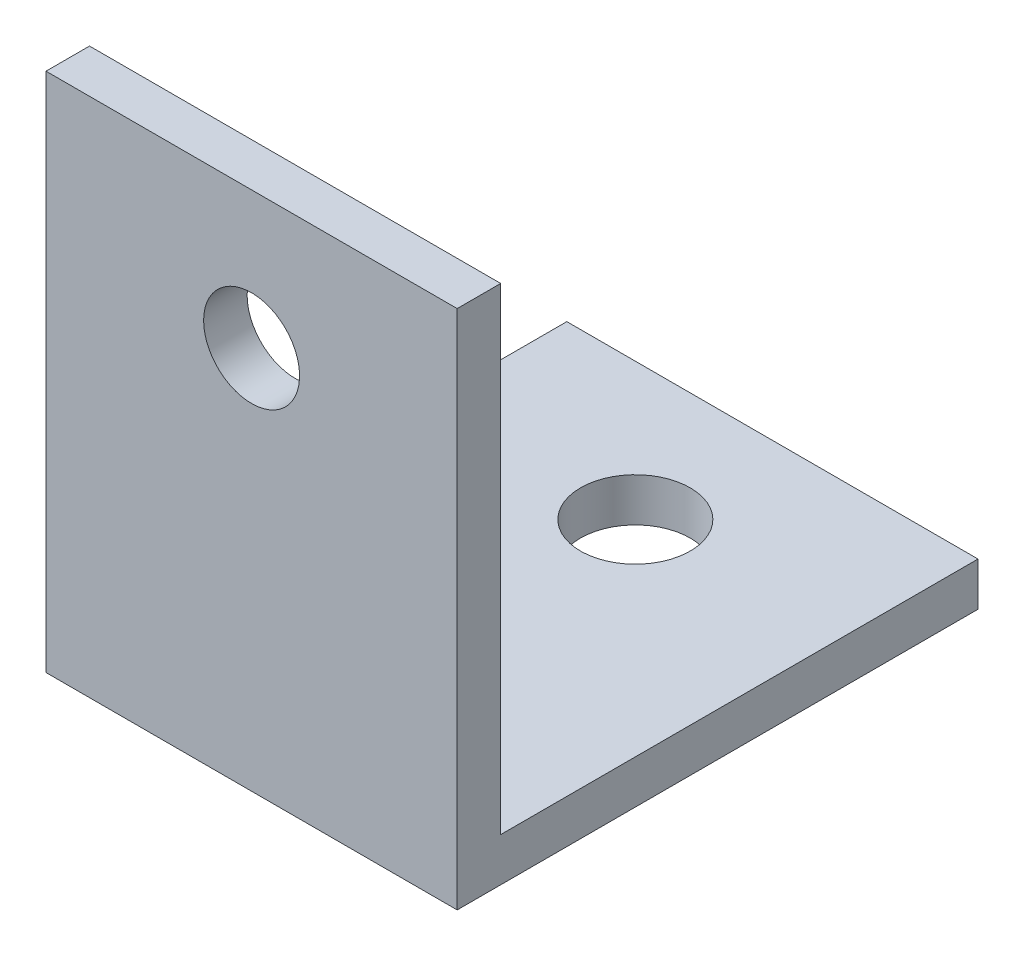
ISO-10303-21;
HEADER;
FILE_DESCRIPTION(('STEP AP214'),'2;1');
FILE_NAME('part.step','',(''),(''),'','','');
FILE_SCHEMA(('AUTOMOTIVE_DESIGN { 1 0 10303 214 1 1 1 1 }'));
ENDSEC;
DATA;
#1=APPLICATION_CONTEXT('core data for automotive mechanical design processes');
#2=APPLICATION_PROTOCOL_DEFINITION('international standard','automotive_design',2000,#1);
#3=PRODUCT_CONTEXT('',#1,'mechanical');
#4=PRODUCT('Part','Part','',(#3));
#5=PRODUCT_RELATED_PRODUCT_CATEGORY('part','',(#4));
#6=PRODUCT_DEFINITION_FORMATION('','',#4);
#7=PRODUCT_DEFINITION_CONTEXT('part definition',#1,'design');
#8=PRODUCT_DEFINITION('design','',#6,#7);
#9=PRODUCT_DEFINITION_SHAPE('','',#8);
#10=(LENGTH_UNIT() NAMED_UNIT(*) SI_UNIT(.MILLI.,.METRE.));
#11=(NAMED_UNIT(*) PLANE_ANGLE_UNIT() SI_UNIT($,.RADIAN.));
#12=(NAMED_UNIT(*) SI_UNIT($,.STERADIAN.) SOLID_ANGLE_UNIT());
#13=UNCERTAINTY_MEASURE_WITH_UNIT(LENGTH_MEASURE(1.E-05),#10,'distance_accuracy_value','');
#14=(GEOMETRIC_REPRESENTATION_CONTEXT(3) GLOBAL_UNCERTAINTY_ASSIGNED_CONTEXT((#13)) GLOBAL_UNIT_ASSIGNED_CONTEXT((#10,
#11,#12)) REPRESENTATION_CONTEXT('',''));
#15=CARTESIAN_POINT('',(0.,0.,0.));
#16=DIRECTION('',(0.,0.,1.));
#17=DIRECTION('',(1.,0.,0.));
#18=AXIS2_PLACEMENT_3D('',#15,#16,#17);
#19=CARTESIAN_POINT('',(0.,0.,3.175));
#20=DIRECTION('',(1.,0.,0.));
#21=DIRECTION('',(0.,0.,-1.));
#22=AXIS2_PLACEMENT_3D('',#19,#20,#21);
#23=PLANE('',#22);
#24=DIRECTION('',(0.,-1.,0.));
#25=VECTOR('',#24,1.);
#26=CARTESIAN_POINT('',(0.,0.,0.));
#27=LINE('',#26,#25);
#28=CARTESIAN_POINT('',(0.,38.,0.));
#29=VERTEX_POINT('',#28);
#30=CARTESIAN_POINT('',(0.,3.175,0.));
#31=VERTEX_POINT('',#30);
#32=EDGE_CURVE('E134',#29,#31,#27,.T.);
#33=ORIENTED_EDGE('',*,*,#32,.T.);
#34=DIRECTION('',(0.,0.,1.));
#35=VECTOR('',#34,1.);
#36=CARTESIAN_POINT('',(0.,3.175,-34.825));
#37=LINE('',#36,#35);
#38=CARTESIAN_POINT('',(0.,3.175,-34.825));
#39=VERTEX_POINT('',#38);
#40=EDGE_CURVE('E131',#39,#31,#37,.T.);
#41=ORIENTED_EDGE('',*,*,#40,.F.);
#42=DIRECTION('',(0.,1.,0.));
#43=VECTOR('',#42,1.);
#44=CARTESIAN_POINT('',(0.,0.,-34.825));
#45=LINE('',#44,#43);
#46=CARTESIAN_POINT('',(0.,0.,-34.825));
#47=VERTEX_POINT('',#46);
#48=EDGE_CURVE('E114',#47,#39,#45,.T.);
#49=ORIENTED_EDGE('',*,*,#48,.F.);
#50=DIRECTION('',(0.,0.,-1.));
#51=VECTOR('',#50,1.);
#52=CARTESIAN_POINT('',(0.,0.,3.175));
#53=LINE('',#52,#51);
#54=CARTESIAN_POINT('',(0.,0.,3.175));
#55=VERTEX_POINT('',#54);
#56=EDGE_CURVE('E11',#55,#47,#53,.T.);
#57=ORIENTED_EDGE('',*,*,#56,.F.);
#58=DIRECTION('',(0.,-1.,0.));
#59=VECTOR('',#58,1.);
#60=CARTESIAN_POINT('',(0.,0.,3.175));
#61=LINE('',#60,#59);
#62=CARTESIAN_POINT('',(0.,38.,3.175));
#63=VERTEX_POINT('',#62);
#64=EDGE_CURVE('E80',#63,#55,#61,.T.);
#65=ORIENTED_EDGE('',*,*,#64,.F.);
#66=DIRECTION('',(0.,0.,-1.));
#67=VECTOR('',#66,1.);
#68=CARTESIAN_POINT('',(0.,38.,3.175));
#69=LINE('',#68,#67);
#70=EDGE_CURVE('E140',#63,#29,#69,.T.);
#71=ORIENTED_EDGE('',*,*,#70,.T.);
#72=EDGE_LOOP('',(#33,#41,#49,#57,#65,#71));
#73=FACE_BOUND('',#72,.T.);
#74=ADVANCED_FACE('F36',(#73),#23,.F.);
#75=CARTESIAN_POINT('',(0.,0.,3.175));
#76=DIRECTION('',(0.,1.,0.));
#77=DIRECTION('',(0.,0.,1.));
#78=AXIS2_PLACEMENT_3D('',#75,#76,#77);
#79=PLANE('',#78);
#80=CARTESIAN_POINT('',(15.,0.,-24.825));
#81=DIRECTION('',(0.,1.,0.));
#82=DIRECTION('',(-1.,0.,0.));
#83=AXIS2_PLACEMENT_3D('',#80,#81,#82);
#84=CIRCLE('',#83,4.);
#85=CARTESIAN_POINT('',(11.,0.,-24.825));
#86=VERTEX_POINT('',#85);
#87=EDGE_CURVE('E121',#86,#86,#84,.T.);
#88=ORIENTED_EDGE('',*,*,#87,.T.);
#89=EDGE_LOOP('',(#88));
#90=FACE_BOUND('',#89,.T.);
#91=ORIENTED_EDGE('',*,*,#56,.T.);
#92=DIRECTION('',(-1.,0.,0.));
#93=VECTOR('',#92,1.);
#94=CARTESIAN_POINT('',(30.,0.,-34.825));
#95=LINE('',#94,#93);
#96=CARTESIAN_POINT('',(30.,0.,-34.825));
#97=VERTEX_POINT('',#96);
#98=EDGE_CURVE('E109',#97,#47,#95,.T.);
#99=ORIENTED_EDGE('',*,*,#98,.F.);
#100=DIRECTION('',(0.,0.,-1.));
#101=VECTOR('',#100,1.);
#102=CARTESIAN_POINT('',(30.,0.,3.175));
#103=LINE('',#102,#101);
#104=CARTESIAN_POINT('',(30.,0.,3.175));
#105=VERTEX_POINT('',#104);
#106=EDGE_CURVE('E44',#105,#97,#103,.T.);
#107=ORIENTED_EDGE('',*,*,#106,.F.);
#108=DIRECTION('',(1.,0.,0.));
#109=VECTOR('',#108,1.);
#110=CARTESIAN_POINT('',(0.,0.,3.175));
#111=LINE('',#110,#109);
#112=EDGE_CURVE('E136',#55,#105,#111,.T.);
#113=ORIENTED_EDGE('',*,*,#112,.F.);
#114=EDGE_LOOP('',(#91,#99,#107,#113));
#115=FACE_BOUND('',#114,.T.);
#116=ADVANCED_FACE('F110',(#90,#115),#79,.F.);
#117=CARTESIAN_POINT('',(30.,0.,3.175));
#118=DIRECTION('',(-1.,0.,0.));
#119=DIRECTION('',(0.,0.,1.));
#120=AXIS2_PLACEMENT_3D('',#117,#118,#119);
#121=PLANE('',#120);
#122=ORIENTED_EDGE('',*,*,#106,.T.);
#123=DIRECTION('',(0.,-1.,0.));
#124=VECTOR('',#123,1.);
#125=CARTESIAN_POINT('',(30.,0.,-34.825));
#126=LINE('',#125,#124);
#127=CARTESIAN_POINT('',(30.,3.175,-34.825));
#128=VERTEX_POINT('',#127);
#129=EDGE_CURVE('E102',#128,#97,#126,.T.);
#130=ORIENTED_EDGE('',*,*,#129,.F.);
#131=DIRECTION('',(0.,0.,1.));
#132=VECTOR('',#131,1.);
#133=CARTESIAN_POINT('',(30.,3.175,-34.825));
#134=LINE('',#133,#132);
#135=CARTESIAN_POINT('',(30.,3.175,0.));
#136=VERTEX_POINT('',#135);
#137=EDGE_CURVE('E128',#128,#136,#134,.T.);
#138=ORIENTED_EDGE('',*,*,#137,.T.);
#139=DIRECTION('',(0.,1.,0.));
#140=VECTOR('',#139,1.);
#141=CARTESIAN_POINT('',(30.,0.,0.));
#142=LINE('',#141,#140);
#143=CARTESIAN_POINT('',(30.,38.,0.));
#144=VERTEX_POINT('',#143);
#145=EDGE_CURVE('E142',#136,#144,#142,.T.);
#146=ORIENTED_EDGE('',*,*,#145,.T.);
#147=DIRECTION('',(0.,0.,-1.));
#148=VECTOR('',#147,1.);
#149=CARTESIAN_POINT('',(30.,38.,3.175));
#150=LINE('',#149,#148);
#151=CARTESIAN_POINT('',(30.,38.,3.175));
#152=VERTEX_POINT('',#151);
#153=EDGE_CURVE('E106',#152,#144,#150,.T.);
#154=ORIENTED_EDGE('',*,*,#153,.F.);
#155=DIRECTION('',(0.,1.,0.));
#156=VECTOR('',#155,1.);
#157=CARTESIAN_POINT('',(30.,0.,3.175));
#158=LINE('',#157,#156);
#159=EDGE_CURVE('E104',#105,#152,#158,.T.);
#160=ORIENTED_EDGE('',*,*,#159,.F.);
#161=EDGE_LOOP('',(#122,#130,#138,#146,#154,#160));
#162=FACE_BOUND('',#161,.T.);
#163=ADVANCED_FACE('F99',(#162),#121,.F.);
#164=CARTESIAN_POINT('',(0.,38.,3.175));
#165=DIRECTION('',(0.,-1.,0.));
#166=DIRECTION('',(0.,0.,-1.));
#167=AXIS2_PLACEMENT_3D('',#164,#165,#166);
#168=PLANE('',#167);
#169=DIRECTION('',(-1.,0.,0.));
#170=VECTOR('',#169,1.);
#171=CARTESIAN_POINT('',(0.,38.,0.));
#172=LINE('',#171,#170);
#173=EDGE_CURVE('E75',#144,#29,#172,.T.);
#174=ORIENTED_EDGE('',*,*,#173,.T.);
#175=ORIENTED_EDGE('',*,*,#70,.F.);
#176=DIRECTION('',(-1.,0.,0.));
#177=VECTOR('',#176,1.);
#178=CARTESIAN_POINT('',(0.,38.,3.175));
#179=LINE('',#178,#177);
#180=EDGE_CURVE('E60',#152,#63,#179,.T.);
#181=ORIENTED_EDGE('',*,*,#180,.F.);
#182=ORIENTED_EDGE('',*,*,#153,.T.);
#183=EDGE_LOOP('',(#174,#175,#181,#182));
#184=FACE_BOUND('',#183,.T.);
#185=ADVANCED_FACE('F146',(#184),#168,.F.);
#186=CARTESIAN_POINT('',(0.,0.,3.175));
#187=DIRECTION('',(0.,0.,-1.));
#188=DIRECTION('',(-1.,0.,0.));
#189=AXIS2_PLACEMENT_3D('',#186,#187,#188);
#190=PLANE('',#189);
#191=ORIENTED_EDGE('',*,*,#159,.T.);
#192=ORIENTED_EDGE('',*,*,#180,.T.);
#193=ORIENTED_EDGE('',*,*,#64,.T.);
#194=ORIENTED_EDGE('',*,*,#112,.T.);
#195=EDGE_LOOP('',(#191,#192,#193,#194));
#196=FACE_BOUND('',#195,.T.);
#197=CARTESIAN_POINT('',(15.,28.,3.175));
#198=DIRECTION('',(0.,0.,-1.));
#199=DIRECTION('',(-1.,0.,0.));
#200=AXIS2_PLACEMENT_3D('',#197,#198,#199);
#201=CIRCLE('',#200,3.5);
#202=CARTESIAN_POINT('',(11.5,28.,3.175));
#203=VERTEX_POINT('',#202);
#204=EDGE_CURVE('E39',#203,#203,#201,.F.);
#205=ORIENTED_EDGE('',*,*,#204,.F.);
#206=EDGE_LOOP('',(#205));
#207=FACE_BOUND('',#206,.T.);
#208=ADVANCED_FACE('F162',(#196,#207),#190,.F.);
#209=CARTESIAN_POINT('',(0.,0.,0.));
#210=DIRECTION('',(0.,0.,-1.));
#211=DIRECTION('',(-1.,0.,0.));
#212=AXIS2_PLACEMENT_3D('',#209,#210,#211);
#213=PLANE('',#212);
#214=DIRECTION('',(1.,0.,0.));
#215=VECTOR('',#214,1.);
#216=CARTESIAN_POINT('',(30.,3.175,0.));
#217=LINE('',#216,#215);
#218=EDGE_CURVE('E51',#31,#136,#217,.T.);
#219=ORIENTED_EDGE('',*,*,#218,.F.);
#220=ORIENTED_EDGE('',*,*,#32,.F.);
#221=ORIENTED_EDGE('',*,*,#173,.F.);
#222=ORIENTED_EDGE('',*,*,#145,.F.);
#223=EDGE_LOOP('',(#219,#220,#221,#222));
#224=FACE_BOUND('',#223,.T.);
#225=CARTESIAN_POINT('',(15.,28.,0.));
#226=DIRECTION('',(0.,0.,-1.));
#227=DIRECTION('',(-1.,0.,0.));
#228=AXIS2_PLACEMENT_3D('',#225,#226,#227);
#229=CIRCLE('',#228,3.5);
#230=CARTESIAN_POINT('',(11.5,28.,0.));
#231=VERTEX_POINT('',#230);
#232=EDGE_CURVE('E185',#231,#231,#229,.T.);
#233=ORIENTED_EDGE('',*,*,#232,.F.);
#234=EDGE_LOOP('',(#233));
#235=FACE_BOUND('',#234,.T.);
#236=ADVANCED_FACE('F147',(#224,#235),#213,.T.);
#237=CARTESIAN_POINT('',(30.,3.175,-34.825));
#238=DIRECTION('',(0.,-1.,0.));
#239=DIRECTION('',(1.,0.,0.));
#240=AXIS2_PLACEMENT_3D('',#237,#238,#239);
#241=PLANE('',#240);
#242=CARTESIAN_POINT('',(15.,3.175,-24.825));
#243=DIRECTION('',(0.,1.,0.));
#244=DIRECTION('',(-1.,0.,0.));
#245=AXIS2_PLACEMENT_3D('',#242,#243,#244);
#246=CIRCLE('',#245,4.);
#247=CARTESIAN_POINT('',(11.,3.175,-24.825));
#248=VERTEX_POINT('',#247);
#249=EDGE_CURVE('E124',#248,#248,#246,.T.);
#250=ORIENTED_EDGE('',*,*,#249,.F.);
#251=EDGE_LOOP('',(#250));
#252=FACE_BOUND('',#251,.T.);
#253=ORIENTED_EDGE('',*,*,#218,.T.);
#254=ORIENTED_EDGE('',*,*,#137,.F.);
#255=DIRECTION('',(1.,0.,0.));
#256=VECTOR('',#255,1.);
#257=CARTESIAN_POINT('',(30.,3.175,-34.825));
#258=LINE('',#257,#256);
#259=EDGE_CURVE('E118',#39,#128,#258,.T.);
#260=ORIENTED_EDGE('',*,*,#259,.F.);
#261=ORIENTED_EDGE('',*,*,#40,.T.);
#262=EDGE_LOOP('',(#253,#254,#260,#261));
#263=FACE_BOUND('',#262,.T.);
#264=ADVANCED_FACE('F152',(#252,#263),#241,.F.);
#265=CARTESIAN_POINT('',(0.,0.,-34.825));
#266=DIRECTION('',(0.,0.,1.));
#267=DIRECTION('',(1.,0.,0.));
#268=AXIS2_PLACEMENT_3D('',#265,#266,#267);
#269=PLANE('',#268);
#270=ORIENTED_EDGE('',*,*,#129,.T.);
#271=ORIENTED_EDGE('',*,*,#98,.T.);
#272=ORIENTED_EDGE('',*,*,#48,.T.);
#273=ORIENTED_EDGE('',*,*,#259,.T.);
#274=EDGE_LOOP('',(#270,#271,#272,#273));
#275=FACE_BOUND('',#274,.T.);
#276=ADVANCED_FACE('F116',(#275),#269,.F.);
#277=CARTESIAN_POINT('',(15.,0.,-24.825));
#278=DIRECTION('',(0.,1.,0.));
#279=DIRECTION('',(-1.,0.,0.));
#280=AXIS2_PLACEMENT_3D('',#277,#278,#279);
#281=CYLINDRICAL_SURFACE('',#280,4.);
#282=ORIENTED_EDGE('',*,*,#87,.F.);
#283=EDGE_LOOP('',(#282));
#284=FACE_BOUND('',#283,.T.);
#285=ORIENTED_EDGE('',*,*,#249,.T.);
#286=EDGE_LOOP('',(#285));
#287=FACE_BOUND('',#286,.T.);
#288=ADVANCED_FACE('F160',(#284,#287),#281,.F.);
#289=CARTESIAN_POINT('',(15.,28.,5.));
#290=DIRECTION('',(0.,0.,-1.));
#291=DIRECTION('',(-1.,0.,0.));
#292=AXIS2_PLACEMENT_3D('',#289,#290,#291);
#293=CYLINDRICAL_SURFACE('',#292,3.5);
#294=ORIENTED_EDGE('',*,*,#204,.T.);
#295=EDGE_LOOP('',(#294));
#296=FACE_BOUND('',#295,.T.);
#297=ORIENTED_EDGE('',*,*,#232,.T.);
#298=EDGE_LOOP('',(#297));
#299=FACE_BOUND('',#298,.T.);
#300=ADVANCED_FACE('F195',(#296,#299),#293,.F.);
#301=CLOSED_SHELL('',(#74,#116,#163,#185,#208,#236,#264,#276,#288,#300));
#302=MANIFOLD_SOLID_BREP('B2',#301);
#303=ADVANCED_BREP_SHAPE_REPRESENTATION('',(#18,#302),#14);
#304=SHAPE_DEFINITION_REPRESENTATION(#9,#303);
ENDSEC;
END-ISO-10303-21;
